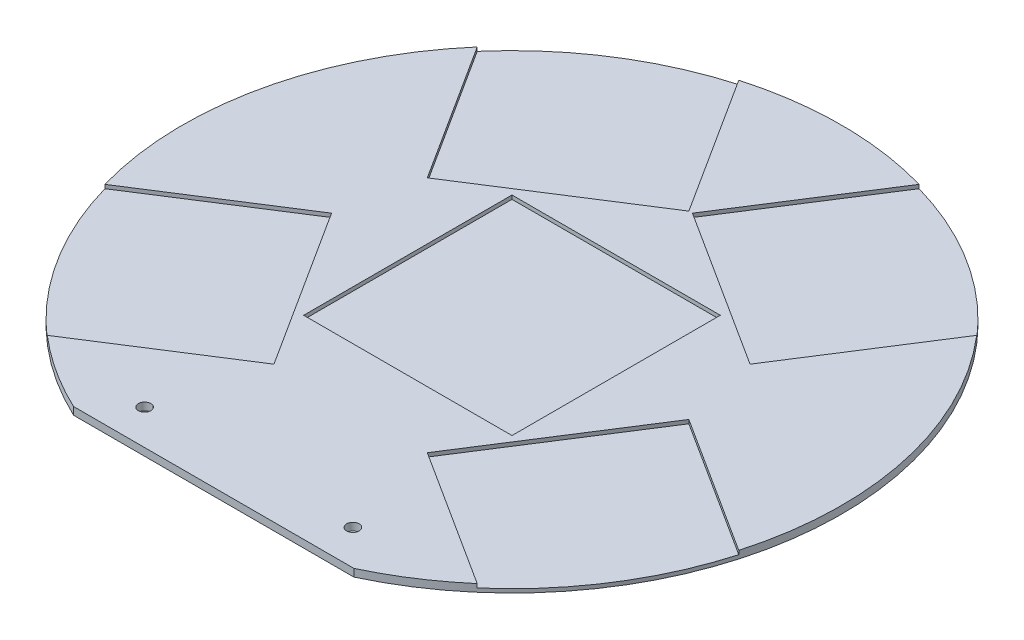
ISO-10303-21;
HEADER;
FILE_DESCRIPTION(('STEP AP214'),'2;1');
FILE_NAME('part.step','',(''),(''),'','','');
FILE_SCHEMA(('AUTOMOTIVE_DESIGN { 1 0 10303 214 1 1 1 1 }'));
ENDSEC;
DATA;
#1=APPLICATION_CONTEXT('core data for automotive mechanical design processes');
#2=APPLICATION_PROTOCOL_DEFINITION('international standard','automotive_design',2000,#1);
#3=PRODUCT_CONTEXT('',#1,'mechanical');
#4=PRODUCT('Part','Part','',(#3));
#5=PRODUCT_RELATED_PRODUCT_CATEGORY('part','',(#4));
#6=PRODUCT_DEFINITION_FORMATION('','',#4);
#7=PRODUCT_DEFINITION_CONTEXT('part definition',#1,'design');
#8=PRODUCT_DEFINITION('design','',#6,#7);
#9=PRODUCT_DEFINITION_SHAPE('','',#8);
#10=(LENGTH_UNIT() NAMED_UNIT(*) SI_UNIT(.MILLI.,.METRE.));
#11=(NAMED_UNIT(*) PLANE_ANGLE_UNIT() SI_UNIT($,.RADIAN.));
#12=(NAMED_UNIT(*) SI_UNIT($,.STERADIAN.) SOLID_ANGLE_UNIT());
#13=UNCERTAINTY_MEASURE_WITH_UNIT(LENGTH_MEASURE(1.E-05),#10,'distance_accuracy_value','');
#14=(GEOMETRIC_REPRESENTATION_CONTEXT(3) GLOBAL_UNCERTAINTY_ASSIGNED_CONTEXT((#13)) GLOBAL_UNIT_ASSIGNED_CONTEXT((#10,
#11,#12)) REPRESENTATION_CONTEXT('',''));
#15=CARTESIAN_POINT('',(0.,0.,0.));
#16=DIRECTION('',(0.,0.,1.));
#17=DIRECTION('',(1.,0.,0.));
#18=AXIS2_PLACEMENT_3D('',#15,#16,#17);
#19=CARTESIAN_POINT('',(0.,2.,0.));
#20=DIRECTION('',(0.,-1.,0.));
#21=DIRECTION('',(0.,0.,-1.));
#22=AXIS2_PLACEMENT_3D('',#19,#20,#21);
#23=CYLINDRICAL_SURFACE('',#22,87.);
#24=DIRECTION('',(0.,-1.,0.));
#25=VECTOR('',#24,1.);
#26=CARTESIAN_POINT('',(83.6801320644722,2.,23.8041067396467));
#27=LINE('',#26,#25);
#28=CARTESIAN_POINT('',(83.6801320644722,1.,23.8041067396467));
#29=VERTEX_POINT('',#28);
#30=CARTESIAN_POINT('',(83.6801320644722,2.,23.8041067396467));
#31=VERTEX_POINT('',#30);
#32=EDGE_CURVE('E203',#29,#31,#27,.F.);
#33=ORIENTED_EDGE('',*,*,#32,.F.);
#34=CARTESIAN_POINT('',(0.,1.,0.));
#35=DIRECTION('',(0.,1.,0.));
#36=DIRECTION('',(0.,0.,1.));
#37=AXIS2_PLACEMENT_3D('',#34,#35,#36);
#38=CIRCLE('',#37,87.);
#39=CARTESIAN_POINT('',(56.7570551413952,1.,65.9366111631211));
#40=VERTEX_POINT('',#39);
#41=EDGE_CURVE('E12',#40,#29,#38,.T.);
#42=ORIENTED_EDGE('',*,*,#41,.F.);
#43=DIRECTION('',(0.,-1.,0.));
#44=VECTOR('',#43,1.);
#45=CARTESIAN_POINT('',(56.7570551413952,2.,65.9366111631211));
#46=LINE('',#45,#44);
#47=CARTESIAN_POINT('',(56.7570551413952,2.,65.9366111631211));
#48=VERTEX_POINT('',#47);
#49=EDGE_CURVE('E239',#48,#40,#46,.T.);
#50=ORIENTED_EDGE('',*,*,#49,.F.);
#51=CARTESIAN_POINT('',(0.,2.,0.));
#52=DIRECTION('',(0.,1.,0.));
#53=DIRECTION('',(0.,0.,1.));
#54=AXIS2_PLACEMENT_3D('',#51,#52,#53);
#55=CIRCLE('',#54,87.);
#56=CARTESIAN_POINT('',(37.,2.,78.7400787401181));
#57=VERTEX_POINT('',#56);
#58=EDGE_CURVE('E317',#57,#48,#55,.T.);
#59=ORIENTED_EDGE('',*,*,#58,.F.);
#60=DIRECTION('',(0.,-1.,0.));
#61=VECTOR('',#60,1.);
#62=CARTESIAN_POINT('',(37.,2.,78.7400787401181));
#63=LINE('',#62,#61);
#64=CARTESIAN_POINT('',(37.,0.,78.7400787401181));
#65=VERTEX_POINT('',#64);
#66=EDGE_CURVE('E324',#57,#65,#63,.T.);
#67=ORIENTED_EDGE('',*,*,#66,.T.);
#68=CARTESIAN_POINT('',(0.,0.,0.));
#69=DIRECTION('',(0.,1.,0.));
#70=DIRECTION('',(0.,0.,1.));
#71=AXIS2_PLACEMENT_3D('',#68,#69,#70);
#72=CIRCLE('',#71,87.);
#73=CARTESIAN_POINT('',(-37.,0.,78.7400787401181));
#74=VERTEX_POINT('',#73);
#75=EDGE_CURVE('E316',#65,#74,#72,.T.);
#76=ORIENTED_EDGE('',*,*,#75,.T.);
#77=DIRECTION('',(0.,-1.,0.));
#78=VECTOR('',#77,1.);
#79=CARTESIAN_POINT('',(-37.,2.,78.7400787401181));
#80=LINE('',#79,#78);
#81=CARTESIAN_POINT('',(-37.,2.,78.7400787401181));
#82=VERTEX_POINT('',#81);
#83=EDGE_CURVE('E332',#82,#74,#80,.T.);
#84=ORIENTED_EDGE('',*,*,#83,.F.);
#85=CARTESIAN_POINT('',(-56.7570551413952,2.,65.9366111631211));
#86=VERTEX_POINT('',#85);
#87=EDGE_CURVE('E329',#86,#82,#55,.T.);
#88=ORIENTED_EDGE('',*,*,#87,.F.);
#89=DIRECTION('',(0.,-1.,0.));
#90=VECTOR('',#89,1.);
#91=CARTESIAN_POINT('',(-56.7570551413952,2.,65.9366111631211));
#92=LINE('',#91,#90);
#93=CARTESIAN_POINT('',(-56.7570551413952,1.,65.9366111631211));
#94=VERTEX_POINT('',#93);
#95=EDGE_CURVE('E285',#86,#94,#92,.T.);
#96=ORIENTED_EDGE('',*,*,#95,.T.);
#97=CARTESIAN_POINT('',(0.,1.,0.));
#98=DIRECTION('',(0.,1.,0.));
#99=DIRECTION('',(0.,0.,1.));
#100=AXIS2_PLACEMENT_3D('',#97,#98,#99);
#101=CIRCLE('',#100,87.);
#102=CARTESIAN_POINT('',(-83.6801320644722,1.,23.8041067396467));
#103=VERTEX_POINT('',#102);
#104=EDGE_CURVE('E342',#103,#94,#101,.T.);
#105=ORIENTED_EDGE('',*,*,#104,.F.);
#106=DIRECTION('',(0.,-1.,0.));
#107=VECTOR('',#106,1.);
#108=CARTESIAN_POINT('',(-83.6801320644722,2.,23.8041067396467));
#109=LINE('',#108,#107);
#110=CARTESIAN_POINT('',(-83.6801320644722,2.,23.8041067396467));
#111=VERTEX_POINT('',#110);
#112=EDGE_CURVE('E282',#103,#111,#109,.F.);
#113=ORIENTED_EDGE('',*,*,#112,.T.);
#114=CARTESIAN_POINT('',(-65.9366111631185,2.,-56.7570551413982));
#115=VERTEX_POINT('',#114);
#116=EDGE_CURVE('E322',#115,#111,#55,.T.);
#117=ORIENTED_EDGE('',*,*,#116,.F.);
#118=DIRECTION('',(0.,-1.,0.));
#119=VECTOR('',#118,1.);
#120=CARTESIAN_POINT('',(-65.9366111631185,2.,-56.7570551413982));
#121=LINE('',#120,#119);
#122=CARTESIAN_POINT('',(-65.9366111631185,1.,-56.7570551413982));
#123=VERTEX_POINT('',#122);
#124=EDGE_CURVE('E260',#115,#123,#121,.T.);
#125=ORIENTED_EDGE('',*,*,#124,.T.);
#126=CARTESIAN_POINT('',(0.,1.,0.));
#127=DIRECTION('',(0.,1.,0.));
#128=DIRECTION('',(0.,0.,1.));
#129=AXIS2_PLACEMENT_3D('',#126,#127,#128);
#130=CIRCLE('',#129,87.);
#131=CARTESIAN_POINT('',(-23.804106739643,1.,-83.6801320644732));
#132=VERTEX_POINT('',#131);
#133=EDGE_CURVE('E340',#132,#123,#130,.T.);
#134=ORIENTED_EDGE('',*,*,#133,.F.);
#135=DIRECTION('',(0.,-1.,0.));
#136=VECTOR('',#135,1.);
#137=CARTESIAN_POINT('',(-23.804106739643,2.,-83.6801320644732));
#138=LINE('',#137,#136);
#139=CARTESIAN_POINT('',(-23.804106739643,2.,-83.6801320644733));
#140=VERTEX_POINT('',#139);
#141=EDGE_CURVE('E279',#132,#140,#138,.F.);
#142=ORIENTED_EDGE('',*,*,#141,.T.);
#143=CARTESIAN_POINT('',(23.804106739643,2.,-83.6801320644733));
#144=VERTEX_POINT('',#143);
#145=EDGE_CURVE('E321',#144,#140,#55,.T.);
#146=ORIENTED_EDGE('',*,*,#145,.F.);
#147=DIRECTION('',(0.,-1.,0.));
#148=VECTOR('',#147,1.);
#149=CARTESIAN_POINT('',(23.804106739643,2.,-83.6801320644732));
#150=LINE('',#149,#148);
#151=CARTESIAN_POINT('',(23.804106739643,1.,-83.6801320644732));
#152=VERTEX_POINT('',#151);
#153=EDGE_CURVE('E63',#152,#144,#150,.F.);
#154=ORIENTED_EDGE('',*,*,#153,.F.);
#155=CARTESIAN_POINT('',(0.,1.,0.));
#156=DIRECTION('',(0.,1.,0.));
#157=DIRECTION('',(0.,0.,1.));
#158=AXIS2_PLACEMENT_3D('',#155,#156,#157);
#159=CIRCLE('',#158,87.);
#160=CARTESIAN_POINT('',(65.9366111631185,1.,-56.7570551413982));
#161=VERTEX_POINT('',#160);
#162=EDGE_CURVE('E48',#161,#152,#159,.T.);
#163=ORIENTED_EDGE('',*,*,#162,.F.);
#164=DIRECTION('',(0.,-1.,0.));
#165=VECTOR('',#164,1.);
#166=CARTESIAN_POINT('',(65.9366111631185,2.,-56.7570551413982));
#167=LINE('',#166,#165);
#168=CARTESIAN_POINT('',(65.9366111631185,2.,-56.7570551413982));
#169=VERTEX_POINT('',#168);
#170=EDGE_CURVE('E236',#169,#161,#167,.T.);
#171=ORIENTED_EDGE('',*,*,#170,.F.);
#172=EDGE_CURVE('E320',#31,#169,#55,.T.);
#173=ORIENTED_EDGE('',*,*,#172,.F.);
#174=EDGE_LOOP('',(#33,#42,#50,#59,#67,#76,#84,#88,#96,#105,#113,#117,#125,#134,#142,#146,#154,
#163,#171,#173));
#175=FACE_BOUND('',#174,.T.);
#176=ADVANCED_FACE('F41',(#175),#23,.T.);
#177=CARTESIAN_POINT('',(0.,2.,0.));
#178=DIRECTION('',(0.,1.,0.));
#179=DIRECTION('',(0.,0.,1.));
#180=AXIS2_PLACEMENT_3D('',#177,#178,#179);
#181=PLANE('',#180);
#182=CARTESIAN_POINT('',(-27.5,2.,69.5));
#183=DIRECTION('',(0.,1.,0.));
#184=DIRECTION('',(0.,0.,1.));
#185=AXIS2_PLACEMENT_3D('',#182,#183,#184);
#186=CIRCLE('',#185,1.65);
#187=CARTESIAN_POINT('',(-27.5,2.,71.15));
#188=VERTEX_POINT('',#187);
#189=EDGE_CURVE('E481',#188,#188,#186,.T.);
#190=ORIENTED_EDGE('',*,*,#189,.F.);
#191=EDGE_LOOP('',(#190));
#192=FACE_BOUND('',#191,.T.);
#193=CARTESIAN_POINT('',(27.5,2.,69.5));
#194=DIRECTION('',(0.,1.,0.));
#195=DIRECTION('',(0.,0.,1.));
#196=AXIS2_PLACEMENT_3D('',#193,#194,#195);
#197=CIRCLE('',#196,1.65);
#198=CARTESIAN_POINT('',(27.5,2.,71.15));
#199=VERTEX_POINT('',#198);
#200=EDGE_CURVE('E482',#199,#199,#197,.T.);
#201=ORIENTED_EDGE('',*,*,#200,.F.);
#202=EDGE_LOOP('',(#201));
#203=FACE_BOUND('',#202,.T.);
#204=DIRECTION('',(0.,0.,-1.));
#205=VECTOR('',#204,1.);
#206=CARTESIAN_POINT('',(27.5,2.,27.5));
#207=LINE('',#206,#205);
#208=CARTESIAN_POINT('',(27.5,2.,27.5));
#209=VERTEX_POINT('',#208);
#210=CARTESIAN_POINT('',(27.5,2.,-27.5));
#211=VERTEX_POINT('',#210);
#212=EDGE_CURVE('E288',#209,#211,#207,.T.);
#213=ORIENTED_EDGE('',*,*,#212,.F.);
#214=DIRECTION('',(1.,0.,0.));
#215=VECTOR('',#214,1.);
#216=CARTESIAN_POINT('',(-27.5,2.,27.5));
#217=LINE('',#216,#215);
#218=CARTESIAN_POINT('',(-27.5,2.,27.5));
#219=VERTEX_POINT('',#218);
#220=EDGE_CURVE('E304',#219,#209,#217,.T.);
#221=ORIENTED_EDGE('',*,*,#220,.F.);
#222=DIRECTION('',(0.,0.,1.));
#223=VECTOR('',#222,1.);
#224=CARTESIAN_POINT('',(-27.5,2.,27.5));
#225=LINE('',#224,#223);
#226=CARTESIAN_POINT('',(-27.5,2.,-27.5));
#227=VERTEX_POINT('',#226);
#228=EDGE_CURVE('E301',#227,#219,#225,.T.);
#229=ORIENTED_EDGE('',*,*,#228,.F.);
#230=DIRECTION('',(-1.,0.,0.));
#231=VECTOR('',#230,1.);
#232=CARTESIAN_POINT('',(-27.5,2.,-27.5));
#233=LINE('',#232,#231);
#234=EDGE_CURVE('E298',#211,#227,#233,.T.);
#235=ORIENTED_EDGE('',*,*,#234,.F.);
#236=EDGE_LOOP('',(#213,#221,#229,#235));
#237=FACE_BOUND('',#236,.T.);
#238=DIRECTION('',(0.538461538461538,0.,-0.842650088469486));
#239=VECTOR('',#238,1.);
#240=CARTESIAN_POINT('',(20.244465077241,2.,42.6047137501987));
#241=LINE('',#240,#239);
#242=CARTESIAN_POINT('',(20.244465077241,2.,42.6047137501987));
#243=VERTEX_POINT('',#242);
#244=CARTESIAN_POINT('',(47.1675420003179,2.,0.472209326724369));
#245=VERTEX_POINT('',#244);
#246=EDGE_CURVE('E55',#243,#245,#241,.T.);
#247=ORIENTED_EDGE('',*,*,#246,.T.);
#248=DIRECTION('',(0.842650088469486,0.,0.538461538461538));
#249=VECTOR('',#248,1.);
#250=CARTESIAN_POINT('',(47.1675420003179,2.,0.472209326724369));
#251=LINE('',#250,#249);
#252=EDGE_CURVE('E200',#245,#31,#251,.T.);
#253=ORIENTED_EDGE('',*,*,#252,.T.);
#254=ORIENTED_EDGE('',*,*,#172,.T.);
#255=DIRECTION('',(-0.538461538461501,0.,0.842650088469511));
#256=VECTOR('',#255,1.);
#257=CARTESIAN_POINT('',(21.0662522117378,2.,13.4615384615375));
#258=LINE('',#257,#256);
#259=CARTESIAN_POINT('',(42.6047137501968,2.,-20.2444650772413));
#260=VERTEX_POINT('',#259);
#261=EDGE_CURVE('E344',#169,#260,#258,.T.);
#262=ORIENTED_EDGE('',*,*,#261,.T.);
#263=DIRECTION('',(-0.84265008846951,0.,-0.538461538461501));
#264=VECTOR('',#263,1.);
#265=CARTESIAN_POINT('',(0.472209326721275,2.,-47.1675420003164));
#266=LINE('',#265,#264);
#267=CARTESIAN_POINT('',(0.472209326721275,2.,-47.1675420003164));
#268=VERTEX_POINT('',#267);
#269=EDGE_CURVE('E225',#260,#268,#266,.T.);
#270=ORIENTED_EDGE('',*,*,#269,.T.);
#271=DIRECTION('',(0.538461538461501,0.,-0.84265008846951));
#272=VECTOR('',#271,1.);
#273=CARTESIAN_POINT('',(0.472209326721275,2.,-47.1675420003164));
#274=LINE('',#273,#272);
#275=EDGE_CURVE('E223',#268,#144,#274,.T.);
#276=ORIENTED_EDGE('',*,*,#275,.T.);
#277=ORIENTED_EDGE('',*,*,#145,.T.);
#278=DIRECTION('',(-0.538461538461501,0.,-0.84265008846951));
#279=VECTOR('',#278,1.);
#280=CARTESIAN_POINT('',(-0.472209326721275,2.,-47.1675420003164));
#281=LINE('',#280,#279);
#282=CARTESIAN_POINT('',(-0.472209326721275,2.,-47.1675420003164));
#283=VERTEX_POINT('',#282);
#284=EDGE_CURVE('E254',#283,#140,#281,.T.);
#285=ORIENTED_EDGE('',*,*,#284,.F.);
#286=DIRECTION('',(0.84265008846951,0.,-0.538461538461501));
#287=VECTOR('',#286,1.);
#288=CARTESIAN_POINT('',(-0.472209326721275,2.,-47.1675420003164));
#289=LINE('',#288,#287);
#290=CARTESIAN_POINT('',(-42.6047137501968,2.,-20.2444650772413));
#291=VERTEX_POINT('',#290);
#292=EDGE_CURVE('E264',#291,#283,#289,.T.);
#293=ORIENTED_EDGE('',*,*,#292,.F.);
#294=DIRECTION('',(0.538461538461501,0.,0.842650088469511));
#295=VECTOR('',#294,1.);
#296=CARTESIAN_POINT('',(-21.0662522117378,2.,13.4615384615375));
#297=LINE('',#296,#295);
#298=EDGE_CURVE('E335',#115,#291,#297,.T.);
#299=ORIENTED_EDGE('',*,*,#298,.F.);
#300=ORIENTED_EDGE('',*,*,#116,.T.);
#301=DIRECTION('',(-0.842650088469486,0.,0.538461538461538));
#302=VECTOR('',#301,1.);
#303=CARTESIAN_POINT('',(-47.1675420003179,2.,0.472209326724369));
#304=LINE('',#303,#302);
#305=CARTESIAN_POINT('',(-47.1675420003179,2.,0.472209326724369));
#306=VERTEX_POINT('',#305);
#307=EDGE_CURVE('E253',#306,#111,#304,.T.);
#308=ORIENTED_EDGE('',*,*,#307,.F.);
#309=DIRECTION('',(-0.538461538461538,0.,-0.842650088469486));
#310=VECTOR('',#309,1.);
#311=CARTESIAN_POINT('',(-20.244465077241,2.,42.6047137501987));
#312=LINE('',#311,#310);
#313=CARTESIAN_POINT('',(-20.244465077241,2.,42.6047137501987));
#314=VERTEX_POINT('',#313);
#315=EDGE_CURVE('E250',#314,#306,#312,.T.);
#316=ORIENTED_EDGE('',*,*,#315,.F.);
#317=DIRECTION('',(0.842650088469487,0.,-0.538461538461538));
#318=VECTOR('',#317,1.);
#319=CARTESIAN_POINT('',(13.4615384615385,2.,21.0662522117372));
#320=LINE('',#319,#318);
#321=EDGE_CURVE('E337',#86,#314,#320,.T.);
#322=ORIENTED_EDGE('',*,*,#321,.F.);
#323=ORIENTED_EDGE('',*,*,#87,.T.);
#324=DIRECTION('',(1.,0.,0.));
#325=VECTOR('',#324,1.);
#326=CARTESIAN_POINT('',(-37.,2.,78.7400787401181));
#327=LINE('',#326,#325);
#328=EDGE_CURVE('E319',#82,#57,#327,.T.);
#329=ORIENTED_EDGE('',*,*,#328,.T.);
#330=ORIENTED_EDGE('',*,*,#58,.T.);
#331=DIRECTION('',(-0.842650088469487,0.,-0.538461538461538));
#332=VECTOR('',#331,1.);
#333=CARTESIAN_POINT('',(-13.4615384615385,2.,21.0662522117372));
#334=LINE('',#333,#332);
#335=EDGE_CURVE('E212',#48,#243,#334,.T.);
#336=ORIENTED_EDGE('',*,*,#335,.T.);
#337=EDGE_LOOP('',(#247,#253,#254,#262,#270,#276,#277,#285,#293,#299,#300,#308,#316,#322,#323,
#329,#330,#336));
#338=FACE_BOUND('',#337,.T.);
#339=ADVANCED_FACE('F210',(#192,#203,#237,#338),#181,.T.);
#340=CARTESIAN_POINT('',(-37.,2.,78.7400787401181));
#341=DIRECTION('',(0.,0.,-1.));
#342=DIRECTION('',(-1.,0.,0.));
#343=AXIS2_PLACEMENT_3D('',#340,#341,#342);
#344=PLANE('',#343);
#345=DIRECTION('',(1.,0.,0.));
#346=VECTOR('',#345,1.);
#347=CARTESIAN_POINT('',(-37.,0.,78.7400787401181));
#348=LINE('',#347,#346);
#349=EDGE_CURVE('E327',#74,#65,#348,.T.);
#350=ORIENTED_EDGE('',*,*,#349,.T.);
#351=ORIENTED_EDGE('',*,*,#66,.F.);
#352=ORIENTED_EDGE('',*,*,#328,.F.);
#353=ORIENTED_EDGE('',*,*,#83,.T.);
#354=EDGE_LOOP('',(#350,#351,#352,#353));
#355=FACE_BOUND('',#354,.T.);
#356=ADVANCED_FACE('F369',(#355),#344,.F.);
#357=CARTESIAN_POINT('',(0.,0.,0.));
#358=DIRECTION('',(0.,1.,0.));
#359=DIRECTION('',(0.,0.,1.));
#360=AXIS2_PLACEMENT_3D('',#357,#358,#359);
#361=PLANE('',#360);
#362=CARTESIAN_POINT('',(-27.5,0.,69.5));
#363=DIRECTION('',(0.,1.,0.));
#364=DIRECTION('',(0.,0.,1.));
#365=AXIS2_PLACEMENT_3D('',#362,#363,#364);
#366=CIRCLE('',#365,1.65);
#367=CARTESIAN_POINT('',(-27.5,0.,71.15));
#368=VERTEX_POINT('',#367);
#369=EDGE_CURVE('E226',#368,#368,#366,.F.);
#370=ORIENTED_EDGE('',*,*,#369,.F.);
#371=EDGE_LOOP('',(#370));
#372=FACE_BOUND('',#371,.T.);
#373=CARTESIAN_POINT('',(27.5,0.,69.5));
#374=DIRECTION('',(0.,1.,0.));
#375=DIRECTION('',(0.,0.,1.));
#376=AXIS2_PLACEMENT_3D('',#373,#374,#375);
#377=CIRCLE('',#376,1.65);
#378=CARTESIAN_POINT('',(27.5,0.,71.15));
#379=VERTEX_POINT('',#378);
#380=EDGE_CURVE('E486',#379,#379,#377,.F.);
#381=ORIENTED_EDGE('',*,*,#380,.F.);
#382=EDGE_LOOP('',(#381));
#383=FACE_BOUND('',#382,.T.);
#384=ORIENTED_EDGE('',*,*,#75,.F.);
#385=ORIENTED_EDGE('',*,*,#349,.F.);
#386=EDGE_LOOP('',(#384,#385));
#387=FACE_BOUND('',#386,.T.);
#388=ADVANCED_FACE('F373',(#372,#383,#387),#361,.F.);
#389=CARTESIAN_POINT('',(27.5,-77.7817459305202,27.5));
#390=DIRECTION('',(1.,0.,0.));
#391=DIRECTION('',(0.,0.,-1.));
#392=AXIS2_PLACEMENT_3D('',#389,#390,#391);
#393=PLANE('',#392);
#394=DIRECTION('',(0.,0.,1.));
#395=VECTOR('',#394,1.);
#396=CARTESIAN_POINT('',(27.5,1.,27.5));
#397=LINE('',#396,#395);
#398=CARTESIAN_POINT('',(27.5,1.,-27.5));
#399=VERTEX_POINT('',#398);
#400=CARTESIAN_POINT('',(27.5,1.,27.5));
#401=VERTEX_POINT('',#400);
#402=EDGE_CURVE('E294',#399,#401,#397,.T.);
#403=ORIENTED_EDGE('',*,*,#402,.T.);
#404=DIRECTION('',(0.,1.,0.));
#405=VECTOR('',#404,1.);
#406=CARTESIAN_POINT('',(27.5,-77.7817459305202,27.5));
#407=LINE('',#406,#405);
#408=EDGE_CURVE('E292',#401,#209,#407,.T.);
#409=ORIENTED_EDGE('',*,*,#408,.T.);
#410=ORIENTED_EDGE('',*,*,#212,.T.);
#411=DIRECTION('',(0.,1.,0.));
#412=VECTOR('',#411,1.);
#413=CARTESIAN_POINT('',(27.5,-77.7817459305202,-27.5));
#414=LINE('',#413,#412);
#415=EDGE_CURVE('E307',#399,#211,#414,.T.);
#416=ORIENTED_EDGE('',*,*,#415,.F.);
#417=EDGE_LOOP('',(#403,#409,#410,#416));
#418=FACE_BOUND('',#417,.T.);
#419=ADVANCED_FACE('F375',(#418),#393,.F.);
#420=CARTESIAN_POINT('',(-27.5,-77.7817459305202,27.5));
#421=DIRECTION('',(0.,0.,1.));
#422=DIRECTION('',(1.,0.,0.));
#423=AXIS2_PLACEMENT_3D('',#420,#421,#422);
#424=PLANE('',#423);
#425=DIRECTION('',(-1.,0.,0.));
#426=VECTOR('',#425,1.);
#427=CARTESIAN_POINT('',(-27.5,1.,27.5));
#428=LINE('',#427,#426);
#429=CARTESIAN_POINT('',(-27.5,1.,27.5));
#430=VERTEX_POINT('',#429);
#431=EDGE_CURVE('E291',#401,#430,#428,.T.);
#432=ORIENTED_EDGE('',*,*,#431,.T.);
#433=DIRECTION('',(0.,1.,0.));
#434=VECTOR('',#433,1.);
#435=CARTESIAN_POINT('',(-27.5,-77.7817459305202,27.5));
#436=LINE('',#435,#434);
#437=EDGE_CURVE('E309',#430,#219,#436,.T.);
#438=ORIENTED_EDGE('',*,*,#437,.T.);
#439=ORIENTED_EDGE('',*,*,#220,.T.);
#440=ORIENTED_EDGE('',*,*,#408,.F.);
#441=EDGE_LOOP('',(#432,#438,#439,#440));
#442=FACE_BOUND('',#441,.T.);
#443=ADVANCED_FACE('F382',(#442),#424,.F.);
#444=CARTESIAN_POINT('',(-27.5,-77.7817459305202,27.5));
#445=DIRECTION('',(-1.,0.,0.));
#446=DIRECTION('',(0.,0.,1.));
#447=AXIS2_PLACEMENT_3D('',#444,#445,#446);
#448=PLANE('',#447);
#449=DIRECTION('',(0.,0.,-1.));
#450=VECTOR('',#449,1.);
#451=CARTESIAN_POINT('',(-27.5,1.,27.5));
#452=LINE('',#451,#450);
#453=CARTESIAN_POINT('',(-27.5,1.,-27.5));
#454=VERTEX_POINT('',#453);
#455=EDGE_CURVE('E289',#430,#454,#452,.T.);
#456=ORIENTED_EDGE('',*,*,#455,.T.);
#457=DIRECTION('',(0.,1.,0.));
#458=VECTOR('',#457,1.);
#459=CARTESIAN_POINT('',(-27.5,-77.7817459305202,-27.5));
#460=LINE('',#459,#458);
#461=EDGE_CURVE('E311',#454,#227,#460,.T.);
#462=ORIENTED_EDGE('',*,*,#461,.T.);
#463=ORIENTED_EDGE('',*,*,#228,.T.);
#464=ORIENTED_EDGE('',*,*,#437,.F.);
#465=EDGE_LOOP('',(#456,#462,#463,#464));
#466=FACE_BOUND('',#465,.T.);
#467=ADVANCED_FACE('F402',(#466),#448,.F.);
#468=CARTESIAN_POINT('',(-27.5,-77.7817459305202,-27.5));
#469=DIRECTION('',(0.,0.,-1.));
#470=DIRECTION('',(-1.,0.,0.));
#471=AXIS2_PLACEMENT_3D('',#468,#469,#470);
#472=PLANE('',#471);
#473=DIRECTION('',(1.,0.,0.));
#474=VECTOR('',#473,1.);
#475=CARTESIAN_POINT('',(-27.5,1.,-27.5));
#476=LINE('',#475,#474);
#477=EDGE_CURVE('E296',#454,#399,#476,.T.);
#478=ORIENTED_EDGE('',*,*,#477,.T.);
#479=ORIENTED_EDGE('',*,*,#415,.T.);
#480=ORIENTED_EDGE('',*,*,#234,.T.);
#481=ORIENTED_EDGE('',*,*,#461,.F.);
#482=EDGE_LOOP('',(#478,#479,#480,#481));
#483=FACE_BOUND('',#482,.T.);
#484=ADVANCED_FACE('F398',(#483),#472,.F.);
#485=CARTESIAN_POINT('',(0.,1.,0.));
#486=DIRECTION('',(0.,1.,0.));
#487=DIRECTION('',(0.,0.,1.));
#488=AXIS2_PLACEMENT_3D('',#485,#486,#487);
#489=PLANE('',#488);
#490=ORIENTED_EDGE('',*,*,#402,.F.);
#491=ORIENTED_EDGE('',*,*,#477,.F.);
#492=ORIENTED_EDGE('',*,*,#455,.F.);
#493=ORIENTED_EDGE('',*,*,#431,.F.);
#494=EDGE_LOOP('',(#490,#491,#492,#493));
#495=FACE_BOUND('',#494,.T.);
#496=ADVANCED_FACE('F401',(#495),#489,.T.);
#497=CARTESIAN_POINT('',(0.,1.,0.));
#498=DIRECTION('',(0.,1.,0.));
#499=DIRECTION('',(0.,0.,1.));
#500=AXIS2_PLACEMENT_3D('',#497,#498,#499);
#501=PLANE('',#500);
#502=ORIENTED_EDGE('',*,*,#133,.T.);
#503=DIRECTION('',(-0.538461538461501,0.,-0.842650088469511));
#504=VECTOR('',#503,1.);
#505=CARTESIAN_POINT('',(-42.6047137501968,1.,-20.2444650772413));
#506=LINE('',#505,#504);
#507=CARTESIAN_POINT('',(-42.6047137501968,1.,-20.2444650772413));
#508=VERTEX_POINT('',#507);
#509=EDGE_CURVE('E267',#508,#123,#506,.T.);
#510=ORIENTED_EDGE('',*,*,#509,.F.);
#511=DIRECTION('',(-0.84265008846951,0.,0.538461538461501));
#512=VECTOR('',#511,1.);
#513=CARTESIAN_POINT('',(-0.472209326721275,1.,-47.1675420003164));
#514=LINE('',#513,#512);
#515=CARTESIAN_POINT('',(-0.472209326721275,1.,-47.1675420003164));
#516=VERTEX_POINT('',#515);
#517=EDGE_CURVE('E273',#516,#508,#514,.T.);
#518=ORIENTED_EDGE('',*,*,#517,.F.);
#519=DIRECTION('',(0.538461538461501,0.,0.84265008846951));
#520=VECTOR('',#519,1.);
#521=CARTESIAN_POINT('',(-0.472209326721275,1.,-47.1675420003164));
#522=LINE('',#521,#520);
#523=EDGE_CURVE('E242',#132,#516,#522,.T.);
#524=ORIENTED_EDGE('',*,*,#523,.F.);
#525=EDGE_LOOP('',(#502,#510,#518,#524));
#526=FACE_BOUND('',#525,.T.);
#527=ADVANCED_FACE('F412',(#526),#501,.T.);
#528=CARTESIAN_POINT('',(-0.472209326721275,-97.6593396978513,-47.1675420003164));
#529=DIRECTION('',(0.84265008846951,0.,-0.538461538461501));
#530=DIRECTION('',(-0.538461538461501,0.,-0.84265008846951));
#531=AXIS2_PLACEMENT_3D('',#528,#529,#530);
#532=PLANE('',#531);
#533=ORIENTED_EDGE('',*,*,#523,.T.);
#534=DIRECTION('',(0.,1.,0.));
#535=VECTOR('',#534,1.);
#536=CARTESIAN_POINT('',(-0.472209326721275,-97.6593396978513,-47.1675420003164));
#537=LINE('',#536,#535);
#538=EDGE_CURVE('E265',#516,#283,#537,.T.);
#539=ORIENTED_EDGE('',*,*,#538,.T.);
#540=ORIENTED_EDGE('',*,*,#284,.T.);
#541=ORIENTED_EDGE('',*,*,#141,.F.);
#542=EDGE_LOOP('',(#533,#539,#540,#541));
#543=FACE_BOUND('',#542,.T.);
#544=ADVANCED_FACE('F416',(#543),#532,.F.);
#545=CARTESIAN_POINT('',(-42.6047137501968,-97.6593396978513,-20.2444650772413));
#546=DIRECTION('',(-0.842650088469511,0.,0.538461538461501));
#547=DIRECTION('',(0.538461538461501,0.,0.842650088469511));
#548=AXIS2_PLACEMENT_3D('',#545,#546,#547);
#549=PLANE('',#548);
#550=ORIENTED_EDGE('',*,*,#298,.T.);
#551=DIRECTION('',(0.,1.,0.));
#552=VECTOR('',#551,1.);
#553=CARTESIAN_POINT('',(-42.6047137501968,-97.6593396978513,-20.2444650772413));
#554=LINE('',#553,#552);
#555=EDGE_CURVE('E261',#508,#291,#554,.T.);
#556=ORIENTED_EDGE('',*,*,#555,.F.);
#557=ORIENTED_EDGE('',*,*,#509,.T.);
#558=ORIENTED_EDGE('',*,*,#124,.F.);
#559=EDGE_LOOP('',(#550,#556,#557,#558));
#560=FACE_BOUND('',#559,.T.);
#561=ADVANCED_FACE('F422',(#560),#549,.F.);
#562=CARTESIAN_POINT('',(-0.472209326721275,-97.6593396978513,-47.1675420003164));
#563=DIRECTION('',(0.538461538461501,0.,0.84265008846951));
#564=DIRECTION('',(0.84265008846951,0.,-0.538461538461501));
#565=AXIS2_PLACEMENT_3D('',#562,#563,#564);
#566=PLANE('',#565);
#567=ORIENTED_EDGE('',*,*,#517,.T.);
#568=ORIENTED_EDGE('',*,*,#555,.T.);
#569=ORIENTED_EDGE('',*,*,#292,.T.);
#570=ORIENTED_EDGE('',*,*,#538,.F.);
#571=EDGE_LOOP('',(#567,#568,#569,#570));
#572=FACE_BOUND('',#571,.T.);
#573=ADVANCED_FACE('F418',(#572),#566,.F.);
#574=CARTESIAN_POINT('',(0.,1.,0.));
#575=DIRECTION('',(0.,1.,0.));
#576=DIRECTION('',(0.,0.,1.));
#577=AXIS2_PLACEMENT_3D('',#574,#575,#576);
#578=PLANE('',#577);
#579=ORIENTED_EDGE('',*,*,#104,.T.);
#580=DIRECTION('',(-0.842650088469487,0.,0.538461538461538));
#581=VECTOR('',#580,1.);
#582=CARTESIAN_POINT('',(-20.244465077241,1.,42.6047137501987));
#583=LINE('',#582,#581);
#584=CARTESIAN_POINT('',(-20.244465077241,1.,42.6047137501987));
#585=VERTEX_POINT('',#584);
#586=EDGE_CURVE('E245',#585,#94,#583,.T.);
#587=ORIENTED_EDGE('',*,*,#586,.F.);
#588=DIRECTION('',(0.538461538461538,0.,0.842650088469487));
#589=VECTOR('',#588,1.);
#590=CARTESIAN_POINT('',(-20.244465077241,1.,42.6047137501987));
#591=LINE('',#590,#589);
#592=CARTESIAN_POINT('',(-47.1675420003179,1.,0.472209326724369));
#593=VERTEX_POINT('',#592);
#594=EDGE_CURVE('E249',#593,#585,#591,.T.);
#595=ORIENTED_EDGE('',*,*,#594,.F.);
#596=DIRECTION('',(0.842650088469486,0.,-0.538461538461539));
#597=VECTOR('',#596,1.);
#598=CARTESIAN_POINT('',(-47.1675420003179,1.,0.472209326724369));
#599=LINE('',#598,#597);
#600=EDGE_CURVE('E243',#103,#593,#599,.T.);
#601=ORIENTED_EDGE('',*,*,#600,.F.);
#602=EDGE_LOOP('',(#579,#587,#595,#601));
#603=FACE_BOUND('',#602,.T.);
#604=ADVANCED_FACE('F421',(#603),#578,.T.);
#605=CARTESIAN_POINT('',(-20.244465077241,-97.6593396978513,42.6047137501987));
#606=DIRECTION('',(0.538461538461538,0.,0.842650088469487));
#607=DIRECTION('',(0.842650088469487,0.,-0.538461538461538));
#608=AXIS2_PLACEMENT_3D('',#605,#606,#607);
#609=PLANE('',#608);
#610=ORIENTED_EDGE('',*,*,#321,.T.);
#611=DIRECTION('',(0.,1.,0.));
#612=VECTOR('',#611,1.);
#613=CARTESIAN_POINT('',(-20.244465077241,-97.6593396978513,42.6047137501987));
#614=LINE('',#613,#612);
#615=EDGE_CURVE('E256',#585,#314,#614,.T.);
#616=ORIENTED_EDGE('',*,*,#615,.F.);
#617=ORIENTED_EDGE('',*,*,#586,.T.);
#618=ORIENTED_EDGE('',*,*,#95,.F.);
#619=EDGE_LOOP('',(#610,#616,#617,#618));
#620=FACE_BOUND('',#619,.T.);
#621=ADVANCED_FACE('F430',(#620),#609,.F.);
#622=CARTESIAN_POINT('',(-47.1675420003179,-97.6593396978513,0.472209326724369));
#623=DIRECTION('',(-0.538461538461539,0.,-0.842650088469486));
#624=DIRECTION('',(-0.842650088469486,0.,0.538461538461539));
#625=AXIS2_PLACEMENT_3D('',#622,#623,#624);
#626=PLANE('',#625);
#627=ORIENTED_EDGE('',*,*,#600,.T.);
#628=DIRECTION('',(0.,1.,0.));
#629=VECTOR('',#628,1.);
#630=CARTESIAN_POINT('',(-47.1675420003179,-97.6593396978513,0.472209326724369));
#631=LINE('',#630,#629);
#632=EDGE_CURVE('E246',#593,#306,#631,.T.);
#633=ORIENTED_EDGE('',*,*,#632,.T.);
#634=ORIENTED_EDGE('',*,*,#307,.T.);
#635=ORIENTED_EDGE('',*,*,#112,.F.);
#636=EDGE_LOOP('',(#627,#633,#634,#635));
#637=FACE_BOUND('',#636,.T.);
#638=ADVANCED_FACE('F433',(#637),#626,.F.);
#639=CARTESIAN_POINT('',(-20.244465077241,-97.6593396978513,42.6047137501987));
#640=DIRECTION('',(0.842650088469487,0.,-0.538461538461538));
#641=DIRECTION('',(-0.538461538461538,0.,-0.842650088469487));
#642=AXIS2_PLACEMENT_3D('',#639,#640,#641);
#643=PLANE('',#642);
#644=ORIENTED_EDGE('',*,*,#594,.T.);
#645=ORIENTED_EDGE('',*,*,#615,.T.);
#646=ORIENTED_EDGE('',*,*,#315,.T.);
#647=ORIENTED_EDGE('',*,*,#632,.F.);
#648=EDGE_LOOP('',(#644,#645,#646,#647));
#649=FACE_BOUND('',#648,.T.);
#650=ADVANCED_FACE('F435',(#649),#643,.F.);
#651=CARTESIAN_POINT('',(0.,1.,0.));
#652=DIRECTION('',(0.,1.,0.));
#653=DIRECTION('',(0.,0.,1.));
#654=AXIS2_PLACEMENT_3D('',#651,#652,#653);
#655=PLANE('',#654);
#656=ORIENTED_EDGE('',*,*,#162,.T.);
#657=DIRECTION('',(-0.538461538461501,0.,0.84265008846951));
#658=VECTOR('',#657,1.);
#659=CARTESIAN_POINT('',(0.472209326721275,1.,-47.1675420003164));
#660=LINE('',#659,#658);
#661=CARTESIAN_POINT('',(0.472209326721275,1.,-47.1675420003164));
#662=VERTEX_POINT('',#661);
#663=EDGE_CURVE('E207',#152,#662,#660,.T.);
#664=ORIENTED_EDGE('',*,*,#663,.T.);
#665=DIRECTION('',(0.84265008846951,0.,0.538461538461501));
#666=VECTOR('',#665,1.);
#667=CARTESIAN_POINT('',(0.472209326721275,1.,-47.1675420003164));
#668=LINE('',#667,#666);
#669=CARTESIAN_POINT('',(42.6047137501968,1.,-20.2444650772413));
#670=VERTEX_POINT('',#669);
#671=EDGE_CURVE('E221',#662,#670,#668,.T.);
#672=ORIENTED_EDGE('',*,*,#671,.T.);
#673=DIRECTION('',(0.538461538461501,0.,-0.842650088469511));
#674=VECTOR('',#673,1.);
#675=CARTESIAN_POINT('',(42.6047137501968,1.,-20.2444650772413));
#676=LINE('',#675,#674);
#677=EDGE_CURVE('E218',#670,#161,#676,.T.);
#678=ORIENTED_EDGE('',*,*,#677,.T.);
#679=EDGE_LOOP('',(#656,#664,#672,#678));
#680=FACE_BOUND('',#679,.T.);
#681=ADVANCED_FACE('F349',(#680),#655,.T.);
#682=CARTESIAN_POINT('',(42.6047137501968,-97.6593396978513,-20.2444650772413));
#683=DIRECTION('',(-0.842650088469511,0.,-0.538461538461501));
#684=DIRECTION('',(-0.538461538461501,0.,0.842650088469511));
#685=AXIS2_PLACEMENT_3D('',#682,#683,#684);
#686=PLANE('',#685);
#687=ORIENTED_EDGE('',*,*,#170,.T.);
#688=ORIENTED_EDGE('',*,*,#677,.F.);
#689=DIRECTION('',(0.,1.,0.));
#690=VECTOR('',#689,1.);
#691=CARTESIAN_POINT('',(42.6047137501968,-97.6593396978513,-20.2444650772413));
#692=LINE('',#691,#690);
#693=EDGE_CURVE('E230',#670,#260,#692,.T.);
#694=ORIENTED_EDGE('',*,*,#693,.T.);
#695=ORIENTED_EDGE('',*,*,#261,.F.);
#696=EDGE_LOOP('',(#687,#688,#694,#695));
#697=FACE_BOUND('',#696,.T.);
#698=ADVANCED_FACE('F448',(#697),#686,.T.);
#699=CARTESIAN_POINT('',(0.472209326721275,-97.6593396978513,-47.1675420003164));
#700=DIRECTION('',(0.84265008846951,0.,0.538461538461501));
#701=DIRECTION('',(0.538461538461501,0.,-0.84265008846951));
#702=AXIS2_PLACEMENT_3D('',#699,#700,#701);
#703=PLANE('',#702);
#704=ORIENTED_EDGE('',*,*,#153,.T.);
#705=ORIENTED_EDGE('',*,*,#275,.F.);
#706=DIRECTION('',(0.,1.,0.));
#707=VECTOR('',#706,1.);
#708=CARTESIAN_POINT('',(0.472209326721275,-97.6593396978513,-47.1675420003164));
#709=LINE('',#708,#707);
#710=EDGE_CURVE('E229',#662,#268,#709,.T.);
#711=ORIENTED_EDGE('',*,*,#710,.F.);
#712=ORIENTED_EDGE('',*,*,#663,.F.);
#713=EDGE_LOOP('',(#704,#705,#711,#712));
#714=FACE_BOUND('',#713,.T.);
#715=ADVANCED_FACE('F354',(#714),#703,.T.);
#716=CARTESIAN_POINT('',(0.472209326721275,-97.6593396978513,-47.1675420003164));
#717=DIRECTION('',(0.538461538461501,0.,-0.84265008846951));
#718=DIRECTION('',(-0.84265008846951,0.,-0.538461538461501));
#719=AXIS2_PLACEMENT_3D('',#716,#717,#718);
#720=PLANE('',#719);
#721=ORIENTED_EDGE('',*,*,#710,.T.);
#722=ORIENTED_EDGE('',*,*,#269,.F.);
#723=ORIENTED_EDGE('',*,*,#693,.F.);
#724=ORIENTED_EDGE('',*,*,#671,.F.);
#725=EDGE_LOOP('',(#721,#722,#723,#724));
#726=FACE_BOUND('',#725,.T.);
#727=ADVANCED_FACE('F447',(#726),#720,.T.);
#728=CARTESIAN_POINT('',(0.,1.,0.));
#729=DIRECTION('',(0.,1.,0.));
#730=DIRECTION('',(0.,0.,1.));
#731=AXIS2_PLACEMENT_3D('',#728,#729,#730);
#732=PLANE('',#731);
#733=ORIENTED_EDGE('',*,*,#41,.T.);
#734=DIRECTION('',(-0.842650088469486,0.,-0.538461538461539));
#735=VECTOR('',#734,1.);
#736=CARTESIAN_POINT('',(47.1675420003179,1.,0.472209326724369));
#737=LINE('',#736,#735);
#738=CARTESIAN_POINT('',(47.1675420003179,1.,0.472209326724368));
#739=VERTEX_POINT('',#738);
#740=EDGE_CURVE('E216',#29,#739,#737,.T.);
#741=ORIENTED_EDGE('',*,*,#740,.T.);
#742=DIRECTION('',(-0.538461538461538,0.,0.842650088469487));
#743=VECTOR('',#742,1.);
#744=CARTESIAN_POINT('',(20.244465077241,1.,42.6047137501987));
#745=LINE('',#744,#743);
#746=CARTESIAN_POINT('',(20.244465077241,1.,42.6047137501987));
#747=VERTEX_POINT('',#746);
#748=EDGE_CURVE('E194',#739,#747,#745,.T.);
#749=ORIENTED_EDGE('',*,*,#748,.T.);
#750=DIRECTION('',(0.842650088469487,0.,0.538461538461538));
#751=VECTOR('',#750,1.);
#752=CARTESIAN_POINT('',(20.244465077241,1.,42.6047137501987));
#753=LINE('',#752,#751);
#754=EDGE_CURVE('E237',#747,#40,#753,.T.);
#755=ORIENTED_EDGE('',*,*,#754,.T.);
#756=EDGE_LOOP('',(#733,#741,#749,#755));
#757=FACE_BOUND('',#756,.T.);
#758=ADVANCED_FACE('F451',(#757),#732,.T.);
#759=CARTESIAN_POINT('',(47.1675420003179,-97.6593396978513,0.472209326724369));
#760=DIRECTION('',(-0.538461538461539,0.,0.842650088469486));
#761=DIRECTION('',(0.842650088469486,0.,0.538461538461539));
#762=AXIS2_PLACEMENT_3D('',#759,#760,#761);
#763=PLANE('',#762);
#764=ORIENTED_EDGE('',*,*,#32,.T.);
#765=ORIENTED_EDGE('',*,*,#252,.F.);
#766=DIRECTION('',(0.,1.,0.));
#767=VECTOR('',#766,1.);
#768=CARTESIAN_POINT('',(47.1675420003179,-97.6593396978513,0.472209326724369));
#769=LINE('',#768,#767);
#770=EDGE_CURVE('E190',#739,#245,#769,.T.);
#771=ORIENTED_EDGE('',*,*,#770,.F.);
#772=ORIENTED_EDGE('',*,*,#740,.F.);
#773=EDGE_LOOP('',(#764,#765,#771,#772));
#774=FACE_BOUND('',#773,.T.);
#775=ADVANCED_FACE('F201',(#774),#763,.T.);
#776=CARTESIAN_POINT('',(20.244465077241,-97.6593396978513,42.6047137501987));
#777=DIRECTION('',(0.538461538461538,0.,-0.842650088469487));
#778=DIRECTION('',(-0.842650088469487,0.,-0.538461538461538));
#779=AXIS2_PLACEMENT_3D('',#776,#777,#778);
#780=PLANE('',#779);
#781=ORIENTED_EDGE('',*,*,#49,.T.);
#782=ORIENTED_EDGE('',*,*,#754,.F.);
#783=DIRECTION('',(0.,1.,0.));
#784=VECTOR('',#783,1.);
#785=CARTESIAN_POINT('',(20.244465077241,-97.6593396978513,42.6047137501987));
#786=LINE('',#785,#784);
#787=EDGE_CURVE('E197',#747,#243,#786,.T.);
#788=ORIENTED_EDGE('',*,*,#787,.T.);
#789=ORIENTED_EDGE('',*,*,#335,.F.);
#790=EDGE_LOOP('',(#781,#782,#788,#789));
#791=FACE_BOUND('',#790,.T.);
#792=ADVANCED_FACE('F458',(#791),#780,.T.);
#793=CARTESIAN_POINT('',(20.244465077241,-97.6593396978513,42.6047137501987));
#794=DIRECTION('',(0.842650088469487,0.,0.538461538461538));
#795=DIRECTION('',(0.538461538461538,0.,-0.842650088469487));
#796=AXIS2_PLACEMENT_3D('',#793,#794,#795);
#797=PLANE('',#796);
#798=ORIENTED_EDGE('',*,*,#770,.T.);
#799=ORIENTED_EDGE('',*,*,#246,.F.);
#800=ORIENTED_EDGE('',*,*,#787,.F.);
#801=ORIENTED_EDGE('',*,*,#748,.F.);
#802=EDGE_LOOP('',(#798,#799,#800,#801));
#803=FACE_BOUND('',#802,.T.);
#804=ADVANCED_FACE('F192',(#803),#797,.T.);
#805=CARTESIAN_POINT('',(27.5,-4.66690475583121,69.5));
#806=DIRECTION('',(0.,1.,0.));
#807=DIRECTION('',(0.,0.,1.));
#808=AXIS2_PLACEMENT_3D('',#805,#806,#807);
#809=CYLINDRICAL_SURFACE('',#808,1.65);
#810=ORIENTED_EDGE('',*,*,#380,.T.);
#811=EDGE_LOOP('',(#810));
#812=FACE_BOUND('',#811,.T.);
#813=ORIENTED_EDGE('',*,*,#200,.T.);
#814=EDGE_LOOP('',(#813));
#815=FACE_BOUND('',#814,.T.);
#816=ADVANCED_FACE('F466',(#812,#815),#809,.F.);
#817=CARTESIAN_POINT('',(-27.5,-4.66690475583121,69.5));
#818=DIRECTION('',(0.,1.,0.));
#819=DIRECTION('',(0.,0.,1.));
#820=AXIS2_PLACEMENT_3D('',#817,#818,#819);
#821=CYLINDRICAL_SURFACE('',#820,1.65);
#822=ORIENTED_EDGE('',*,*,#369,.T.);
#823=EDGE_LOOP('',(#822));
#824=FACE_BOUND('',#823,.T.);
#825=ORIENTED_EDGE('',*,*,#189,.T.);
#826=EDGE_LOOP('',(#825));
#827=FACE_BOUND('',#826,.T.);
#828=ADVANCED_FACE('F472',(#824,#827),#821,.F.);
#829=CLOSED_SHELL('',(#176,#339,#356,#388,#419,#443,#467,#484,#496,#527,#544,#561,#573,#604,
#621,#638,#650,#681,#698,#715,#727,#758,#775,#792,#804,#816,#828));
#830=MANIFOLD_SOLID_BREP('B2',#829);
#831=ADVANCED_BREP_SHAPE_REPRESENTATION('',(#18,#830),#14);
#832=SHAPE_DEFINITION_REPRESENTATION(#9,#831);
ENDSEC;
END-ISO-10303-21;
